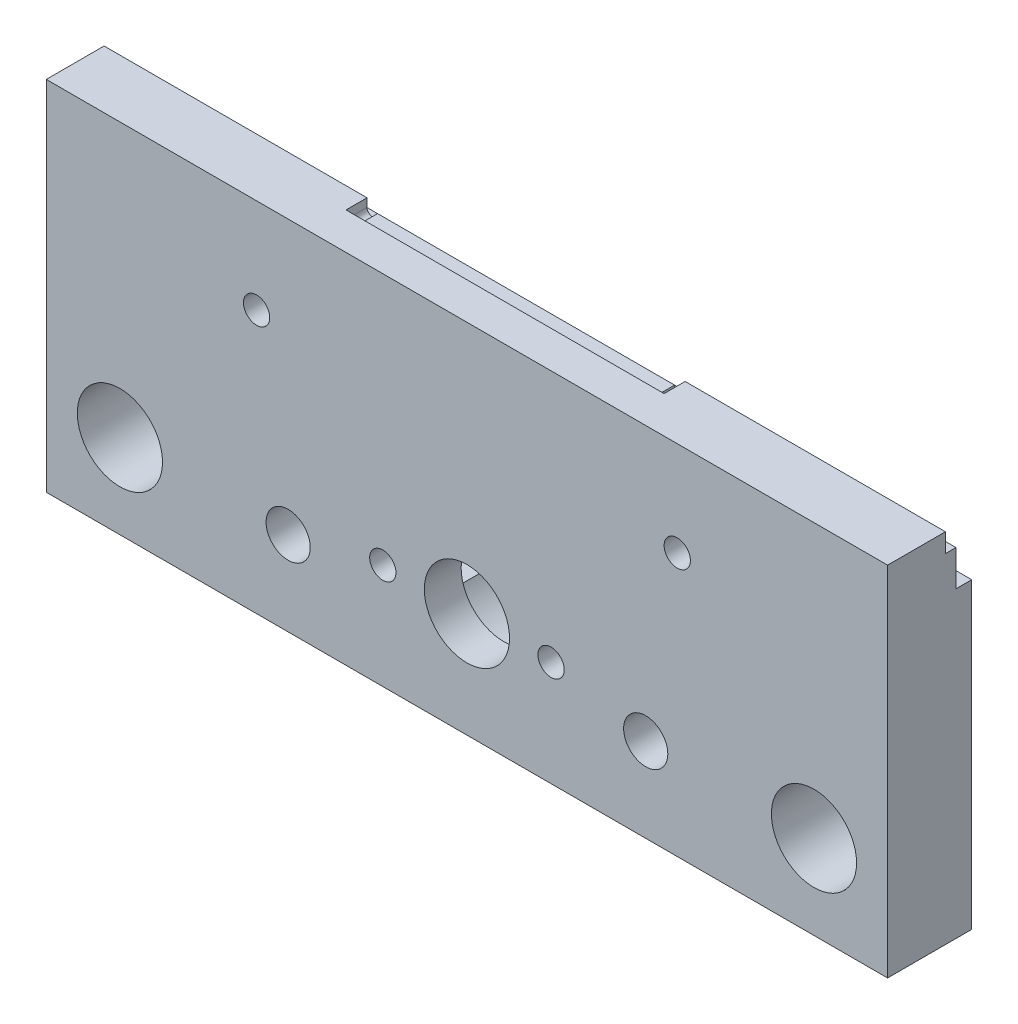
ISO-10303-21;
HEADER;
FILE_DESCRIPTION(('STEP AP214'),'2;1');
FILE_NAME('part.step','',(''),(''),'','','');
FILE_SCHEMA(('AUTOMOTIVE_DESIGN { 1 0 10303 214 1 1 1 1 }'));
ENDSEC;
DATA;
#1=APPLICATION_CONTEXT('core data for automotive mechanical design processes');
#2=APPLICATION_PROTOCOL_DEFINITION('international standard','automotive_design',2000,#1);
#3=PRODUCT_CONTEXT('',#1,'mechanical');
#4=PRODUCT('Part','Part','',(#3));
#5=PRODUCT_RELATED_PRODUCT_CATEGORY('part','',(#4));
#6=PRODUCT_DEFINITION_FORMATION('','',#4);
#7=PRODUCT_DEFINITION_CONTEXT('part definition',#1,'design');
#8=PRODUCT_DEFINITION('design','',#6,#7);
#9=PRODUCT_DEFINITION_SHAPE('','',#8);
#10=(LENGTH_UNIT() NAMED_UNIT(*) SI_UNIT(.MILLI.,.METRE.));
#11=(NAMED_UNIT(*) PLANE_ANGLE_UNIT() SI_UNIT($,.RADIAN.));
#12=(NAMED_UNIT(*) SI_UNIT($,.STERADIAN.) SOLID_ANGLE_UNIT());
#13=UNCERTAINTY_MEASURE_WITH_UNIT(LENGTH_MEASURE(1.E-05),#10,'distance_accuracy_value','');
#14=(GEOMETRIC_REPRESENTATION_CONTEXT(3) GLOBAL_UNCERTAINTY_ASSIGNED_CONTEXT((#13)) GLOBAL_UNIT_ASSIGNED_CONTEXT((#10,
#11,#12)) REPRESENTATION_CONTEXT('',''));
#15=CARTESIAN_POINT('',(0.,0.,0.));
#16=DIRECTION('',(0.,0.,1.));
#17=DIRECTION('',(1.,0.,0.));
#18=AXIS2_PLACEMENT_3D('',#15,#16,#17);
#19=CARTESIAN_POINT('',(40.,10.,8.));
#20=DIRECTION('',(0.,0.,-1.));
#21=DIRECTION('',(-1.,0.,0.));
#22=AXIS2_PLACEMENT_3D('',#19,#20,#21);
#23=CYLINDRICAL_SURFACE('',#22,4.05);
#24=CARTESIAN_POINT('',(40.,10.,8.));
#25=DIRECTION('',(0.,0.,1.));
#26=DIRECTION('',(1.,0.,0.));
#27=AXIS2_PLACEMENT_3D('',#24,#25,#26);
#28=CIRCLE('',#27,4.05);
#29=CARTESIAN_POINT('',(44.05,10.,8.));
#30=VERTEX_POINT('',#29);
#31=EDGE_CURVE('E333',#30,#30,#28,.T.);
#32=ORIENTED_EDGE('',*,*,#31,.T.);
#33=EDGE_LOOP('',(#32));
#34=FACE_BOUND('',#33,.T.);
#35=CARTESIAN_POINT('',(40.,10.,4.5));
#36=DIRECTION('',(0.,0.,-1.));
#37=DIRECTION('',(-1.,0.,0.));
#38=AXIS2_PLACEMENT_3D('',#35,#36,#37);
#39=CIRCLE('',#38,4.05);
#40=CARTESIAN_POINT('',(35.95,10.,4.5));
#41=VERTEX_POINT('',#40);
#42=EDGE_CURVE('E44',#41,#41,#39,.T.);
#43=ORIENTED_EDGE('',*,*,#42,.T.);
#44=EDGE_LOOP('',(#43));
#45=FACE_BOUND('',#44,.T.);
#46=ADVANCED_FACE('F35',(#34,#45),#23,.F.);
#47=CARTESIAN_POINT('',(0.,0.,8.));
#48=DIRECTION('',(0.,0.,1.));
#49=DIRECTION('',(1.,0.,0.));
#50=AXIS2_PLACEMENT_3D('',#47,#48,#49);
#51=PLANE('',#50);
#52=CARTESIAN_POINT('',(23.,8.,8.));
#53=DIRECTION('',(0.,0.,1.));
#54=DIRECTION('',(1.,0.,0.));
#55=AXIS2_PLACEMENT_3D('',#52,#53,#54);
#56=CIRCLE('',#55,2.1);
#57=CARTESIAN_POINT('',(25.1,8.,8.));
#58=VERTEX_POINT('',#57);
#59=EDGE_CURVE('E406',#58,#58,#56,.T.);
#60=ORIENTED_EDGE('',*,*,#59,.F.);
#61=EDGE_LOOP('',(#60));
#62=FACE_BOUND('',#61,.T.);
#63=CARTESIAN_POINT('',(57.,8.,8.));
#64=DIRECTION('',(0.,0.,1.));
#65=DIRECTION('',(1.,0.,0.));
#66=AXIS2_PLACEMENT_3D('',#63,#64,#65);
#67=CIRCLE('',#66,2.1);
#68=CARTESIAN_POINT('',(59.1,8.,8.));
#69=VERTEX_POINT('',#68);
#70=EDGE_CURVE('E400',#69,#69,#67,.T.);
#71=ORIENTED_EDGE('',*,*,#70,.F.);
#72=EDGE_LOOP('',(#71));
#73=FACE_BOUND('',#72,.T.);
#74=CARTESIAN_POINT('',(20.,25.,8.));
#75=DIRECTION('',(0.,0.,1.));
#76=DIRECTION('',(1.,0.,0.));
#77=AXIS2_PLACEMENT_3D('',#74,#75,#76);
#78=CIRCLE('',#77,1.24999999999999);
#79=CARTESIAN_POINT('',(21.25,25.,8.));
#80=VERTEX_POINT('',#79);
#81=EDGE_CURVE('E394',#80,#80,#78,.T.);
#82=ORIENTED_EDGE('',*,*,#81,.F.);
#83=EDGE_LOOP('',(#82));
#84=FACE_BOUND('',#83,.T.);
#85=CARTESIAN_POINT('',(60.,25.,8.));
#86=DIRECTION('',(0.,0.,1.));
#87=DIRECTION('',(1.,0.,0.));
#88=AXIS2_PLACEMENT_3D('',#85,#86,#87);
#89=CIRCLE('',#88,1.24999999999999);
#90=CARTESIAN_POINT('',(61.25,25.,8.));
#91=VERTEX_POINT('',#90);
#92=EDGE_CURVE('E388',#91,#91,#89,.T.);
#93=ORIENTED_EDGE('',*,*,#92,.F.);
#94=EDGE_LOOP('',(#93));
#95=FACE_BOUND('',#94,.T.);
#96=CARTESIAN_POINT('',(32.,10.,8.));
#97=DIRECTION('',(0.,0.,1.));
#98=DIRECTION('',(1.,0.,0.));
#99=AXIS2_PLACEMENT_3D('',#96,#97,#98);
#100=CIRCLE('',#99,1.24999999999999);
#101=CARTESIAN_POINT('',(33.25,10.,8.));
#102=VERTEX_POINT('',#101);
#103=EDGE_CURVE('E381',#102,#102,#100,.T.);
#104=ORIENTED_EDGE('',*,*,#103,.F.);
#105=EDGE_LOOP('',(#104));
#106=FACE_BOUND('',#105,.T.);
#107=CARTESIAN_POINT('',(48.,10.,8.));
#108=DIRECTION('',(0.,0.,1.));
#109=DIRECTION('',(1.,0.,0.));
#110=AXIS2_PLACEMENT_3D('',#107,#108,#109);
#111=CIRCLE('',#110,1.24999999999999);
#112=CARTESIAN_POINT('',(49.25,10.,8.));
#113=VERTEX_POINT('',#112);
#114=EDGE_CURVE('E374',#113,#113,#111,.T.);
#115=ORIENTED_EDGE('',*,*,#114,.F.);
#116=EDGE_LOOP('',(#115));
#117=FACE_BOUND('',#116,.T.);
#118=ORIENTED_EDGE('',*,*,#31,.F.);
#119=EDGE_LOOP('',(#118));
#120=FACE_BOUND('',#119,.T.);
#121=DIRECTION('',(0.,-1.,0.));
#122=VECTOR('',#121,1.);
#123=CARTESIAN_POINT('',(0.,34.,8.));
#124=LINE('',#123,#122);
#125=CARTESIAN_POINT('',(0.,34.,8.));
#126=VERTEX_POINT('',#125);
#127=CARTESIAN_POINT('',(0.,0.,8.));
#128=VERTEX_POINT('',#127);
#129=EDGE_CURVE('E345',#126,#128,#124,.T.);
#130=ORIENTED_EDGE('',*,*,#129,.T.);
#131=DIRECTION('',(1.,0.,0.));
#132=VECTOR('',#131,1.);
#133=CARTESIAN_POINT('',(0.,0.,8.));
#134=LINE('',#133,#132);
#135=CARTESIAN_POINT('',(80.,0.,8.));
#136=VERTEX_POINT('',#135);
#137=EDGE_CURVE('E348',#128,#136,#134,.T.);
#138=ORIENTED_EDGE('',*,*,#137,.T.);
#139=DIRECTION('',(0.,1.,0.));
#140=VECTOR('',#139,1.);
#141=CARTESIAN_POINT('',(80.,0.,8.));
#142=LINE('',#141,#140);
#143=CARTESIAN_POINT('',(80.,34.,8.));
#144=VERTEX_POINT('',#143);
#145=EDGE_CURVE('E351',#136,#144,#142,.T.);
#146=ORIENTED_EDGE('',*,*,#145,.T.);
#147=DIRECTION('',(-1.,0.,0.));
#148=VECTOR('',#147,1.);
#149=CARTESIAN_POINT('',(80.,34.,8.));
#150=LINE('',#149,#148);
#151=EDGE_CURVE('E353',#144,#126,#150,.T.);
#152=ORIENTED_EDGE('',*,*,#151,.T.);
#153=EDGE_LOOP('',(#130,#138,#146,#152));
#154=FACE_BOUND('',#153,.T.);
#155=CARTESIAN_POINT('',(7.,8.,8.));
#156=DIRECTION('',(0.,0.,1.));
#157=DIRECTION('',(1.,0.,0.));
#158=AXIS2_PLACEMENT_3D('',#155,#156,#157);
#159=CIRCLE('',#158,4.05);
#160=CARTESIAN_POINT('',(11.05,8.,8.));
#161=VERTEX_POINT('',#160);
#162=EDGE_CURVE('E339',#161,#161,#159,.T.);
#163=ORIENTED_EDGE('',*,*,#162,.F.);
#164=EDGE_LOOP('',(#163));
#165=FACE_BOUND('',#164,.T.);
#166=CARTESIAN_POINT('',(73.,8.,8.));
#167=DIRECTION('',(0.,0.,1.));
#168=DIRECTION('',(1.,0.,0.));
#169=AXIS2_PLACEMENT_3D('',#166,#167,#168);
#170=CIRCLE('',#169,4.05);
#171=CARTESIAN_POINT('',(77.05,8.,8.));
#172=VERTEX_POINT('',#171);
#173=EDGE_CURVE('E330',#172,#172,#170,.T.);
#174=ORIENTED_EDGE('',*,*,#173,.F.);
#175=EDGE_LOOP('',(#174));
#176=FACE_BOUND('',#175,.T.);
#177=ADVANCED_FACE('F412',(#62,#73,#84,#95,#106,#117,#120,#154,#165,#176),#51,.T.);
#178=CARTESIAN_POINT('',(0.,0.,0.));
#179=DIRECTION('',(0.,0.,1.));
#180=DIRECTION('',(1.,0.,0.));
#181=AXIS2_PLACEMENT_3D('',#178,#179,#180);
#182=PLANE('',#181);
#183=CARTESIAN_POINT('',(23.,8.,0.));
#184=DIRECTION('',(0.,0.,1.));
#185=DIRECTION('',(1.,0.,0.));
#186=AXIS2_PLACEMENT_3D('',#183,#184,#185);
#187=CIRCLE('',#186,2.1);
#188=CARTESIAN_POINT('',(25.1,8.,0.));
#189=VERTEX_POINT('',#188);
#190=EDGE_CURVE('E403',#189,#189,#187,.T.);
#191=ORIENTED_EDGE('',*,*,#190,.T.);
#192=EDGE_LOOP('',(#191));
#193=FACE_BOUND('',#192,.T.);
#194=CARTESIAN_POINT('',(57.,8.,0.));
#195=DIRECTION('',(0.,0.,1.));
#196=DIRECTION('',(1.,0.,0.));
#197=AXIS2_PLACEMENT_3D('',#194,#195,#196);
#198=CIRCLE('',#197,2.1);
#199=CARTESIAN_POINT('',(59.1,8.,0.));
#200=VERTEX_POINT('',#199);
#201=EDGE_CURVE('E397',#200,#200,#198,.T.);
#202=ORIENTED_EDGE('',*,*,#201,.T.);
#203=EDGE_LOOP('',(#202));
#204=FACE_BOUND('',#203,.T.);
#205=CARTESIAN_POINT('',(20.,25.,0.));
#206=DIRECTION('',(0.,0.,1.));
#207=DIRECTION('',(1.,0.,0.));
#208=AXIS2_PLACEMENT_3D('',#205,#206,#207);
#209=CIRCLE('',#208,1.25);
#210=CARTESIAN_POINT('',(21.25,25.,0.));
#211=VERTEX_POINT('',#210);
#212=EDGE_CURVE('E391',#211,#211,#209,.T.);
#213=ORIENTED_EDGE('',*,*,#212,.T.);
#214=EDGE_LOOP('',(#213));
#215=FACE_BOUND('',#214,.T.);
#216=CARTESIAN_POINT('',(60.,25.,0.));
#217=DIRECTION('',(0.,0.,1.));
#218=DIRECTION('',(1.,0.,0.));
#219=AXIS2_PLACEMENT_3D('',#216,#217,#218);
#220=CIRCLE('',#219,1.25);
#221=CARTESIAN_POINT('',(61.25,25.,0.));
#222=VERTEX_POINT('',#221);
#223=EDGE_CURVE('E385',#222,#222,#220,.T.);
#224=ORIENTED_EDGE('',*,*,#223,.T.);
#225=EDGE_LOOP('',(#224));
#226=FACE_BOUND('',#225,.T.);
#227=DIRECTION('',(0.,-1.,0.));
#228=VECTOR('',#227,1.);
#229=CARTESIAN_POINT('',(0.,34.,0.));
#230=LINE('',#229,#228);
#231=CARTESIAN_POINT('',(0.,28.7999999999897,0.));
#232=VERTEX_POINT('',#231);
#233=CARTESIAN_POINT('',(0.,0.,0.));
#234=VERTEX_POINT('',#233);
#235=EDGE_CURVE('E342',#232,#234,#230,.T.);
#236=ORIENTED_EDGE('',*,*,#235,.F.);
#237=DIRECTION('',(1.,0.,0.));
#238=VECTOR('',#237,1.);
#239=CARTESIAN_POINT('',(0.,28.7999999999897,0.));
#240=LINE('',#239,#238);
#241=CARTESIAN_POINT('',(80.,28.7999999999897,0.));
#242=VERTEX_POINT('',#241);
#243=EDGE_CURVE('E318',#232,#242,#240,.T.);
#244=ORIENTED_EDGE('',*,*,#243,.T.);
#245=DIRECTION('',(0.,1.,0.));
#246=VECTOR('',#245,1.);
#247=CARTESIAN_POINT('',(80.,0.,0.));
#248=LINE('',#247,#246);
#249=CARTESIAN_POINT('',(80.,0.,0.));
#250=VERTEX_POINT('',#249);
#251=EDGE_CURVE('E349',#250,#242,#248,.T.);
#252=ORIENTED_EDGE('',*,*,#251,.F.);
#253=DIRECTION('',(1.,0.,0.));
#254=VECTOR('',#253,1.);
#255=CARTESIAN_POINT('',(0.,0.,0.));
#256=LINE('',#255,#254);
#257=EDGE_CURVE('E357',#234,#250,#256,.T.);
#258=ORIENTED_EDGE('',*,*,#257,.F.);
#259=EDGE_LOOP('',(#236,#244,#252,#258));
#260=FACE_BOUND('',#259,.T.);
#261=CARTESIAN_POINT('',(7.,8.,0.));
#262=DIRECTION('',(0.,0.,1.));
#263=DIRECTION('',(1.,0.,0.));
#264=AXIS2_PLACEMENT_3D('',#261,#262,#263);
#265=CIRCLE('',#264,4.05);
#266=CARTESIAN_POINT('',(11.05,8.,0.));
#267=VERTEX_POINT('',#266);
#268=EDGE_CURVE('E338',#267,#267,#265,.T.);
#269=ORIENTED_EDGE('',*,*,#268,.T.);
#270=EDGE_LOOP('',(#269));
#271=FACE_BOUND('',#270,.T.);
#272=DIRECTION('',(1.,0.,0.));
#273=VECTOR('',#272,1.);
#274=CARTESIAN_POINT('',(30.5,12.85,0.));
#275=LINE('',#274,#273);
#276=CARTESIAN_POINT('',(45.5623735940693,12.85,0.));
#277=VERTEX_POINT('',#276);
#278=CARTESIAN_POINT('',(49.5,12.85,0.));
#279=VERTEX_POINT('',#278);
#280=EDGE_CURVE('E275',#277,#279,#275,.T.);
#281=ORIENTED_EDGE('',*,*,#280,.F.);
#282=CARTESIAN_POINT('',(40.,10.,0.));
#283=DIRECTION('',(0.,0.,-1.));
#284=DIRECTION('',(-1.,0.,0.));
#285=AXIS2_PLACEMENT_3D('',#282,#283,#284);
#286=CIRCLE('',#285,6.25);
#287=CARTESIAN_POINT('',(34.4376264059307,12.85,0.));
#288=VERTEX_POINT('',#287);
#289=EDGE_CURVE('E247',#288,#277,#286,.T.);
#290=ORIENTED_EDGE('',*,*,#289,.F.);
#291=CARTESIAN_POINT('',(30.5,12.85,0.));
#292=VERTEX_POINT('',#291);
#293=EDGE_CURVE('E276',#292,#288,#275,.T.);
#294=ORIENTED_EDGE('',*,*,#293,.F.);
#295=CARTESIAN_POINT('',(30.5,10.,0.));
#296=DIRECTION('',(0.,0.,-1.));
#297=DIRECTION('',(-1.,0.,0.));
#298=AXIS2_PLACEMENT_3D('',#295,#296,#297);
#299=CIRCLE('',#298,2.85);
#300=CARTESIAN_POINT('',(30.5,7.15,0.));
#301=VERTEX_POINT('',#300);
#302=EDGE_CURVE('E257',#301,#292,#299,.T.);
#303=ORIENTED_EDGE('',*,*,#302,.F.);
#304=DIRECTION('',(-1.,0.,0.));
#305=VECTOR('',#304,1.);
#306=CARTESIAN_POINT('',(49.5,7.15,0.));
#307=LINE('',#306,#305);
#308=CARTESIAN_POINT('',(34.4376264059307,7.15,0.));
#309=VERTEX_POINT('',#308);
#310=EDGE_CURVE('E282',#309,#301,#307,.T.);
#311=ORIENTED_EDGE('',*,*,#310,.F.);
#312=CARTESIAN_POINT('',(45.5623735940693,7.15,0.));
#313=VERTEX_POINT('',#312);
#314=EDGE_CURVE('E236',#313,#309,#286,.T.);
#315=ORIENTED_EDGE('',*,*,#314,.F.);
#316=CARTESIAN_POINT('',(49.5,7.15,0.));
#317=VERTEX_POINT('',#316);
#318=EDGE_CURVE('E262',#317,#313,#307,.T.);
#319=ORIENTED_EDGE('',*,*,#318,.F.);
#320=CARTESIAN_POINT('',(49.5,10.,0.));
#321=DIRECTION('',(0.,0.,-1.));
#322=DIRECTION('',(-1.,0.,0.));
#323=AXIS2_PLACEMENT_3D('',#320,#321,#322);
#324=CIRCLE('',#323,2.85);
#325=EDGE_CURVE('E279',#279,#317,#324,.T.);
#326=ORIENTED_EDGE('',*,*,#325,.F.);
#327=EDGE_LOOP('',(#281,#290,#294,#303,#311,#315,#319,#326));
#328=FACE_BOUND('',#327,.T.);
#329=CARTESIAN_POINT('',(73.,8.,0.));
#330=DIRECTION('',(0.,0.,1.));
#331=DIRECTION('',(1.,0.,0.));
#332=AXIS2_PLACEMENT_3D('',#329,#330,#331);
#333=CIRCLE('',#332,4.05);
#334=CARTESIAN_POINT('',(77.05,8.,0.));
#335=VERTEX_POINT('',#334);
#336=EDGE_CURVE('E321',#335,#335,#333,.T.);
#337=ORIENTED_EDGE('',*,*,#336,.T.);
#338=EDGE_LOOP('',(#337));
#339=FACE_BOUND('',#338,.T.);
#340=ADVANCED_FACE('F415',(#193,#204,#215,#226,#260,#271,#328,#339),#182,.F.);
#341=CARTESIAN_POINT('',(0.,34.,8.));
#342=DIRECTION('',(1.,0.,0.));
#343=DIRECTION('',(0.,0.,-1.));
#344=AXIS2_PLACEMENT_3D('',#341,#342,#343);
#345=PLANE('',#344);
#346=DIRECTION('',(0.,-1.,0.));
#347=VECTOR('',#346,1.);
#348=CARTESIAN_POINT('',(0.,32.2,1.5));
#349=LINE('',#348,#347);
#350=CARTESIAN_POINT('',(0.,32.2,1.5));
#351=VERTEX_POINT('',#350);
#352=CARTESIAN_POINT('',(0.,28.8,1.5));
#353=VERTEX_POINT('',#352);
#354=EDGE_CURVE('E302',#351,#353,#349,.T.);
#355=ORIENTED_EDGE('',*,*,#354,.T.);
#356=DIRECTION('',(0.,-6.85562717706034E-12,-1.));
#357=VECTOR('',#356,1.);
#358=CARTESIAN_POINT('',(0.,28.8,1.5));
#359=LINE('',#358,#357);
#360=EDGE_CURVE('E305',#353,#232,#359,.T.);
#361=ORIENTED_EDGE('',*,*,#360,.T.);
#362=ORIENTED_EDGE('',*,*,#235,.T.);
#363=DIRECTION('',(0.,0.,-1.));
#364=VECTOR('',#363,1.);
#365=CARTESIAN_POINT('',(0.,0.,8.));
#366=LINE('',#365,#364);
#367=EDGE_CURVE('E369',#128,#234,#366,.T.);
#368=ORIENTED_EDGE('',*,*,#367,.F.);
#369=ORIENTED_EDGE('',*,*,#129,.F.);
#370=DIRECTION('',(0.,0.,-1.));
#371=VECTOR('',#370,1.);
#372=CARTESIAN_POINT('',(0.,34.,8.));
#373=LINE('',#372,#371);
#374=CARTESIAN_POINT('',(0.,34.,2.5));
#375=VERTEX_POINT('',#374);
#376=EDGE_CURVE('E355',#126,#375,#373,.T.);
#377=ORIENTED_EDGE('',*,*,#376,.T.);
#378=DIRECTION('',(0.,-1.,0.));
#379=VECTOR('',#378,1.);
#380=CARTESIAN_POINT('',(0.,32.2,2.5));
#381=LINE('',#380,#379);
#382=CARTESIAN_POINT('',(0.,32.2,2.5));
#383=VERTEX_POINT('',#382);
#384=EDGE_CURVE('E295',#375,#383,#381,.T.);
#385=ORIENTED_EDGE('',*,*,#384,.T.);
#386=DIRECTION('',(0.,0.,-1.));
#387=VECTOR('',#386,1.);
#388=CARTESIAN_POINT('',(0.,32.2,1.5));
#389=LINE('',#388,#387);
#390=EDGE_CURVE('E298',#383,#351,#389,.T.);
#391=ORIENTED_EDGE('',*,*,#390,.T.);
#392=EDGE_LOOP('',(#355,#361,#362,#368,#369,#377,#385,#391));
#393=FACE_BOUND('',#392,.T.);
#394=ADVANCED_FACE('F37',(#393),#345,.F.);
#395=CARTESIAN_POINT('',(0.,0.,8.));
#396=DIRECTION('',(0.,1.,0.));
#397=DIRECTION('',(0.,0.,1.));
#398=AXIS2_PLACEMENT_3D('',#395,#396,#397);
#399=PLANE('',#398);
#400=ORIENTED_EDGE('',*,*,#257,.T.);
#401=DIRECTION('',(0.,0.,-1.));
#402=VECTOR('',#401,1.);
#403=CARTESIAN_POINT('',(80.,0.,8.));
#404=LINE('',#403,#402);
#405=EDGE_CURVE('E366',#136,#250,#404,.T.);
#406=ORIENTED_EDGE('',*,*,#405,.F.);
#407=ORIENTED_EDGE('',*,*,#137,.F.);
#408=ORIENTED_EDGE('',*,*,#367,.T.);
#409=EDGE_LOOP('',(#400,#406,#407,#408));
#410=FACE_BOUND('',#409,.T.);
#411=ADVANCED_FACE('F449',(#410),#399,.F.);
#412=CARTESIAN_POINT('',(80.,0.,8.));
#413=DIRECTION('',(-1.,0.,0.));
#414=DIRECTION('',(0.,0.,1.));
#415=AXIS2_PLACEMENT_3D('',#412,#413,#414);
#416=PLANE('',#415);
#417=ORIENTED_EDGE('',*,*,#251,.T.);
#418=DIRECTION('',(0.,-6.85562717706034E-12,-1.));
#419=VECTOR('',#418,1.);
#420=CARTESIAN_POINT('',(80.,28.8,1.5));
#421=LINE('',#420,#419);
#422=CARTESIAN_POINT('',(80.,28.8,1.5));
#423=VERTEX_POINT('',#422);
#424=EDGE_CURVE('E299',#423,#242,#421,.T.);
#425=ORIENTED_EDGE('',*,*,#424,.F.);
#426=DIRECTION('',(0.,-1.,0.));
#427=VECTOR('',#426,1.);
#428=CARTESIAN_POINT('',(80.,32.2,1.5));
#429=LINE('',#428,#427);
#430=CARTESIAN_POINT('',(80.,32.2,1.5));
#431=VERTEX_POINT('',#430);
#432=EDGE_CURVE('E314',#431,#423,#429,.T.);
#433=ORIENTED_EDGE('',*,*,#432,.F.);
#434=DIRECTION('',(0.,0.,-1.));
#435=VECTOR('',#434,1.);
#436=CARTESIAN_POINT('',(80.,32.2,1.5));
#437=LINE('',#436,#435);
#438=CARTESIAN_POINT('',(80.,32.2,2.5));
#439=VERTEX_POINT('',#438);
#440=EDGE_CURVE('E311',#439,#431,#437,.T.);
#441=ORIENTED_EDGE('',*,*,#440,.F.);
#442=DIRECTION('',(0.,-1.,0.));
#443=VECTOR('',#442,1.);
#444=CARTESIAN_POINT('',(80.,32.2,2.5));
#445=LINE('',#444,#443);
#446=CARTESIAN_POINT('',(80.,34.,2.5));
#447=VERTEX_POINT('',#446);
#448=EDGE_CURVE('E288',#447,#439,#445,.T.);
#449=ORIENTED_EDGE('',*,*,#448,.F.);
#450=DIRECTION('',(0.,0.,-1.));
#451=VECTOR('',#450,1.);
#452=CARTESIAN_POINT('',(80.,34.,8.));
#453=LINE('',#452,#451);
#454=EDGE_CURVE('E363',#144,#447,#453,.T.);
#455=ORIENTED_EDGE('',*,*,#454,.F.);
#456=ORIENTED_EDGE('',*,*,#145,.F.);
#457=ORIENTED_EDGE('',*,*,#405,.T.);
#458=EDGE_LOOP('',(#417,#425,#433,#441,#449,#455,#456,#457));
#459=FACE_BOUND('',#458,.T.);
#460=ADVANCED_FACE('F466',(#459),#416,.F.);
#461=CARTESIAN_POINT('',(80.,34.,8.));
#462=DIRECTION('',(0.,-1.,0.));
#463=DIRECTION('',(1.,0.,0.));
#464=AXIS2_PLACEMENT_3D('',#461,#462,#463);
#465=PLANE('',#464);
#466=DIRECTION('',(1.,0.,0.));
#467=VECTOR('',#466,1.);
#468=CARTESIAN_POINT('',(25.000000000049,34.,4.49999999999999));
#469=LINE('',#468,#467);
#470=CARTESIAN_POINT('',(25.000000000049,34.,4.49999999999999));
#471=VERTEX_POINT('',#470);
#472=CARTESIAN_POINT('',(55.247938177816,34.,4.49999999999999));
#473=VERTEX_POINT('',#472);
#474=EDGE_CURVE('E204',#471,#473,#469,.T.);
#475=ORIENTED_EDGE('',*,*,#474,.F.);
#476=DIRECTION('',(0.,0.,-1.));
#477=VECTOR('',#476,1.);
#478=CARTESIAN_POINT('',(25.000000000049,34.,4.49999999999999));
#479=LINE('',#478,#477);
#480=CARTESIAN_POINT('',(25.000000000049,34.,2.49999999999999));
#481=VERTEX_POINT('',#480);
#482=EDGE_CURVE('E187',#471,#481,#479,.T.);
#483=ORIENTED_EDGE('',*,*,#482,.T.);
#484=DIRECTION('',(1.,0.,0.));
#485=VECTOR('',#484,1.);
#486=CARTESIAN_POINT('',(0.,34.,2.5));
#487=LINE('',#486,#485);
#488=EDGE_CURVE('E328',#375,#481,#487,.T.);
#489=ORIENTED_EDGE('',*,*,#488,.F.);
#490=ORIENTED_EDGE('',*,*,#376,.F.);
#491=ORIENTED_EDGE('',*,*,#151,.F.);
#492=ORIENTED_EDGE('',*,*,#454,.T.);
#493=CARTESIAN_POINT('',(55.247938177816,34.,2.5));
#494=VERTEX_POINT('',#493);
#495=EDGE_CURVE('E308',#494,#447,#487,.T.);
#496=ORIENTED_EDGE('',*,*,#495,.F.);
#497=DIRECTION('',(0.,0.,-1.));
#498=VECTOR('',#497,1.);
#499=CARTESIAN_POINT('',(55.247938177816,34.,4.49999999999999));
#500=LINE('',#499,#498);
#501=EDGE_CURVE('E52',#473,#494,#500,.T.);
#502=ORIENTED_EDGE('',*,*,#501,.F.);
#503=EDGE_LOOP('',(#475,#483,#489,#490,#491,#492,#496,#502));
#504=FACE_BOUND('',#503,.T.);
#505=ADVANCED_FACE('F209',(#504),#465,.F.);
#506=CARTESIAN_POINT('',(7.,8.,8.));
#507=DIRECTION('',(0.,0.,-1.));
#508=DIRECTION('',(-1.,0.,0.));
#509=AXIS2_PLACEMENT_3D('',#506,#507,#508);
#510=CYLINDRICAL_SURFACE('',#509,4.05);
#511=ORIENTED_EDGE('',*,*,#162,.T.);
#512=EDGE_LOOP('',(#511));
#513=FACE_BOUND('',#512,.T.);
#514=ORIENTED_EDGE('',*,*,#268,.F.);
#515=EDGE_LOOP('',(#514));
#516=FACE_BOUND('',#515,.T.);
#517=ADVANCED_FACE('F439',(#513,#516),#510,.F.);
#518=CARTESIAN_POINT('',(73.,8.,8.));
#519=DIRECTION('',(0.,0.,-1.));
#520=DIRECTION('',(-1.,0.,0.));
#521=AXIS2_PLACEMENT_3D('',#518,#519,#520);
#522=CYLINDRICAL_SURFACE('',#521,4.05);
#523=ORIENTED_EDGE('',*,*,#173,.T.);
#524=EDGE_LOOP('',(#523));
#525=FACE_BOUND('',#524,.T.);
#526=ORIENTED_EDGE('',*,*,#336,.F.);
#527=EDGE_LOOP('',(#526));
#528=FACE_BOUND('',#527,.T.);
#529=ADVANCED_FACE('F435',(#525,#528),#522,.F.);
#530=CARTESIAN_POINT('',(0.,28.8,1.5));
#531=DIRECTION('',(0.,-1.,6.85562717706035E-12));
#532=DIRECTION('',(0.,-6.85562717706035E-12,-1.));
#533=AXIS2_PLACEMENT_3D('',#530,#531,#532);
#534=PLANE('',#533);
#535=ORIENTED_EDGE('',*,*,#424,.T.);
#536=ORIENTED_EDGE('',*,*,#243,.F.);
#537=ORIENTED_EDGE('',*,*,#360,.F.);
#538=DIRECTION('',(1.,0.,0.));
#539=VECTOR('',#538,1.);
#540=CARTESIAN_POINT('',(0.,28.8,1.5));
#541=LINE('',#540,#539);
#542=EDGE_CURVE('E322',#353,#423,#541,.T.);
#543=ORIENTED_EDGE('',*,*,#542,.T.);
#544=EDGE_LOOP('',(#535,#536,#537,#543));
#545=FACE_BOUND('',#544,.T.);
#546=ADVANCED_FACE('F438',(#545),#534,.F.);
#547=CARTESIAN_POINT('',(0.,32.2,1.5));
#548=DIRECTION('',(0.,0.,1.));
#549=DIRECTION('',(0.,-1.,0.));
#550=AXIS2_PLACEMENT_3D('',#547,#548,#549);
#551=PLANE('',#550);
#552=ORIENTED_EDGE('',*,*,#432,.T.);
#553=ORIENTED_EDGE('',*,*,#542,.F.);
#554=ORIENTED_EDGE('',*,*,#354,.F.);
#555=DIRECTION('',(1.,0.,0.));
#556=VECTOR('',#555,1.);
#557=CARTESIAN_POINT('',(0.,32.2,1.5));
#558=LINE('',#557,#556);
#559=EDGE_CURVE('E324',#351,#431,#558,.T.);
#560=ORIENTED_EDGE('',*,*,#559,.T.);
#561=EDGE_LOOP('',(#552,#553,#554,#560));
#562=FACE_BOUND('',#561,.T.);
#563=ADVANCED_FACE('F530',(#562),#551,.F.);
#564=CARTESIAN_POINT('',(0.,32.2,1.5));
#565=DIRECTION('',(0.,-1.,0.));
#566=DIRECTION('',(0.,0.,-1.));
#567=AXIS2_PLACEMENT_3D('',#564,#565,#566);
#568=PLANE('',#567);
#569=ORIENTED_EDGE('',*,*,#440,.T.);
#570=ORIENTED_EDGE('',*,*,#559,.F.);
#571=ORIENTED_EDGE('',*,*,#390,.F.);
#572=DIRECTION('',(1.,0.,0.));
#573=VECTOR('',#572,1.);
#574=CARTESIAN_POINT('',(0.,32.2,2.5));
#575=LINE('',#574,#573);
#576=EDGE_CURVE('E326',#383,#439,#575,.T.);
#577=ORIENTED_EDGE('',*,*,#576,.T.);
#578=EDGE_LOOP('',(#569,#570,#571,#577));
#579=FACE_BOUND('',#578,.T.);
#580=ADVANCED_FACE('F534',(#579),#568,.F.);
#581=CARTESIAN_POINT('',(0.,32.2,2.5));
#582=DIRECTION('',(0.,0.,1.));
#583=DIRECTION('',(0.,-1.,0.));
#584=AXIS2_PLACEMENT_3D('',#581,#582,#583);
#585=PLANE('',#584);
#586=ORIENTED_EDGE('',*,*,#488,.T.);
#587=DIRECTION('',(0.,1.,0.));
#588=VECTOR('',#587,1.);
#589=CARTESIAN_POINT('',(25.000000000049,34.,2.49999999999999));
#590=LINE('',#589,#588);
#591=CARTESIAN_POINT('',(25.000000000049,33.2,2.49999999999999));
#592=VERTEX_POINT('',#591);
#593=EDGE_CURVE('E193',#592,#481,#590,.T.);
#594=ORIENTED_EDGE('',*,*,#593,.F.);
#595=CARTESIAN_POINT('',(25.500000000049,33.2,2.49999999999999));
#596=DIRECTION('',(0.,0.,-1.));
#597=DIRECTION('',(-1.,0.,0.));
#598=AXIS2_PLACEMENT_3D('',#595,#596,#597);
#599=CIRCLE('',#598,0.500000000000002);
#600=CARTESIAN_POINT('',(26.000000000049,33.2,2.49999999999999));
#601=VERTEX_POINT('',#600);
#602=EDGE_CURVE('E207',#601,#592,#599,.T.);
#603=ORIENTED_EDGE('',*,*,#602,.F.);
#604=DIRECTION('',(-1.,0.,0.));
#605=VECTOR('',#604,1.);
#606=CARTESIAN_POINT('',(26.000000000049,33.2,2.49999999999999));
#607=LINE('',#606,#605);
#608=CARTESIAN_POINT('',(54.247938177816,33.2,2.49999999999999));
#609=VERTEX_POINT('',#608);
#610=EDGE_CURVE('E229',#609,#601,#607,.T.);
#611=ORIENTED_EDGE('',*,*,#610,.F.);
#612=CARTESIAN_POINT('',(54.747938177816,33.2,2.49999999999999));
#613=DIRECTION('',(0.,0.,-1.));
#614=DIRECTION('',(-1.,0.,0.));
#615=AXIS2_PLACEMENT_3D('',#612,#613,#614);
#616=CIRCLE('',#615,0.5);
#617=CARTESIAN_POINT('',(55.247938177816,33.2,2.49999999999999));
#618=VERTEX_POINT('',#617);
#619=EDGE_CURVE('E226',#618,#609,#616,.T.);
#620=ORIENTED_EDGE('',*,*,#619,.F.);
#621=DIRECTION('',(0.,-1.,0.));
#622=VECTOR('',#621,1.);
#623=CARTESIAN_POINT('',(55.247938177816,34.,2.49999999999999));
#624=LINE('',#623,#622);
#625=EDGE_CURVE('E223',#494,#618,#624,.T.);
#626=ORIENTED_EDGE('',*,*,#625,.F.);
#627=ORIENTED_EDGE('',*,*,#495,.T.);
#628=ORIENTED_EDGE('',*,*,#448,.T.);
#629=ORIENTED_EDGE('',*,*,#576,.F.);
#630=ORIENTED_EDGE('',*,*,#384,.F.);
#631=EDGE_LOOP('',(#586,#594,#603,#611,#620,#626,#627,#628,#629,#630));
#632=FACE_BOUND('',#631,.T.);
#633=ADVANCED_FACE('F525',(#632),#585,.F.);
#634=CARTESIAN_POINT('',(30.5,12.85,4.5));
#635=DIRECTION('',(0.,1.,0.));
#636=DIRECTION('',(0.,0.,1.));
#637=AXIS2_PLACEMENT_3D('',#634,#635,#636);
#638=PLANE('',#637);
#639=ORIENTED_EDGE('',*,*,#293,.T.);
#640=DIRECTION('',(0.,0.,-1.));
#641=VECTOR('',#640,1.);
#642=CARTESIAN_POINT('',(34.4376264059307,12.85,4.5));
#643=LINE('',#642,#641);
#644=CARTESIAN_POINT('',(34.4376264059307,12.85,4.5));
#645=VERTEX_POINT('',#644);
#646=EDGE_CURVE('E254',#288,#645,#643,.F.);
#647=ORIENTED_EDGE('',*,*,#646,.T.);
#648=DIRECTION('',(1.,0.,0.));
#649=VECTOR('',#648,1.);
#650=CARTESIAN_POINT('',(30.5,12.85,4.5));
#651=LINE('',#650,#649);
#652=CARTESIAN_POINT('',(30.5,12.85,4.5));
#653=VERTEX_POINT('',#652);
#654=EDGE_CURVE('E263',#653,#645,#651,.T.);
#655=ORIENTED_EDGE('',*,*,#654,.F.);
#656=DIRECTION('',(0.,0.,-1.));
#657=VECTOR('',#656,1.);
#658=CARTESIAN_POINT('',(30.5,12.85,4.5));
#659=LINE('',#658,#657);
#660=EDGE_CURVE('E272',#653,#292,#659,.T.);
#661=ORIENTED_EDGE('',*,*,#660,.T.);
#662=EDGE_LOOP('',(#639,#647,#655,#661));
#663=FACE_BOUND('',#662,.T.);
#664=ADVANCED_FACE('F503',(#663),#638,.F.);
#665=CARTESIAN_POINT('',(49.5,7.15,4.5));
#666=DIRECTION('',(0.,-1.,0.));
#667=DIRECTION('',(0.,0.,-1.));
#668=AXIS2_PLACEMENT_3D('',#665,#666,#667);
#669=PLANE('',#668);
#670=DIRECTION('',(-1.,0.,0.));
#671=VECTOR('',#670,1.);
#672=CARTESIAN_POINT('',(49.5,7.15,4.5));
#673=LINE('',#672,#671);
#674=CARTESIAN_POINT('',(34.4376264059307,7.15,4.5));
#675=VERTEX_POINT('',#674);
#676=CARTESIAN_POINT('',(30.5,7.15,4.5));
#677=VERTEX_POINT('',#676);
#678=EDGE_CURVE('E268',#675,#677,#673,.T.);
#679=ORIENTED_EDGE('',*,*,#678,.F.);
#680=DIRECTION('',(0.,0.,-1.));
#681=VECTOR('',#680,1.);
#682=CARTESIAN_POINT('',(34.4376264059307,7.15,4.5));
#683=LINE('',#682,#681);
#684=EDGE_CURVE('E251',#675,#309,#683,.T.);
#685=ORIENTED_EDGE('',*,*,#684,.T.);
#686=ORIENTED_EDGE('',*,*,#310,.T.);
#687=DIRECTION('',(0.,0.,-1.));
#688=VECTOR('',#687,1.);
#689=CARTESIAN_POINT('',(30.5,7.15,4.5));
#690=LINE('',#689,#688);
#691=EDGE_CURVE('E285',#677,#301,#690,.T.);
#692=ORIENTED_EDGE('',*,*,#691,.F.);
#693=EDGE_LOOP('',(#679,#685,#686,#692));
#694=FACE_BOUND('',#693,.T.);
#695=ADVANCED_FACE('F497',(#694),#669,.F.);
#696=CARTESIAN_POINT('',(30.5,10.,4.5));
#697=DIRECTION('',(0.,0.,-1.));
#698=DIRECTION('',(-1.,0.,0.));
#699=AXIS2_PLACEMENT_3D('',#696,#697,#698);
#700=CYLINDRICAL_SURFACE('',#699,2.85);
#701=ORIENTED_EDGE('',*,*,#302,.T.);
#702=ORIENTED_EDGE('',*,*,#660,.F.);
#703=CARTESIAN_POINT('',(30.5,10.,4.5));
#704=DIRECTION('',(0.,0.,-1.));
#705=DIRECTION('',(-1.,0.,0.));
#706=AXIS2_PLACEMENT_3D('',#703,#704,#705);
#707=CIRCLE('',#706,2.85);
#708=EDGE_CURVE('E258',#677,#653,#707,.T.);
#709=ORIENTED_EDGE('',*,*,#708,.F.);
#710=ORIENTED_EDGE('',*,*,#691,.T.);
#711=EDGE_LOOP('',(#701,#702,#709,#710));
#712=FACE_BOUND('',#711,.T.);
#713=ADVANCED_FACE('F500',(#712),#700,.F.);
#714=CARTESIAN_POINT('',(45.5623735940693,12.85,4.5));
#715=VERTEX_POINT('',#714);
#716=CARTESIAN_POINT('',(49.5,12.85,4.5));
#717=VERTEX_POINT('',#716);
#718=EDGE_CURVE('E261',#715,#717,#651,.T.);
#719=ORIENTED_EDGE('',*,*,#718,.F.);
#720=DIRECTION('',(0.,0.,-1.));
#721=VECTOR('',#720,1.);
#722=CARTESIAN_POINT('',(45.5623735940693,12.85,4.5));
#723=LINE('',#722,#721);
#724=EDGE_CURVE('E245',#715,#277,#723,.T.);
#725=ORIENTED_EDGE('',*,*,#724,.T.);
#726=ORIENTED_EDGE('',*,*,#280,.T.);
#727=DIRECTION('',(0.,0.,-1.));
#728=VECTOR('',#727,1.);
#729=CARTESIAN_POINT('',(49.5,12.85,4.5));
#730=LINE('',#729,#728);
#731=EDGE_CURVE('E291',#717,#279,#730,.T.);
#732=ORIENTED_EDGE('',*,*,#731,.F.);
#733=EDGE_LOOP('',(#719,#725,#726,#732));
#734=FACE_BOUND('',#733,.T.);
#735=ADVANCED_FACE('F479',(#734),#638,.F.);
#736=CARTESIAN_POINT('',(30.5,10.,4.5));
#737=DIRECTION('',(0.,0.,-1.));
#738=DIRECTION('',(-1.,0.,0.));
#739=AXIS2_PLACEMENT_3D('',#736,#737,#738);
#740=PLANE('',#739);
#741=CARTESIAN_POINT('',(32.,10.,4.5));
#742=DIRECTION('',(0.,0.,-1.));
#743=DIRECTION('',(-1.,0.,0.));
#744=AXIS2_PLACEMENT_3D('',#741,#742,#743);
#745=CIRCLE('',#744,1.24999999999999);
#746=CARTESIAN_POINT('',(30.75,10.,4.5));
#747=VERTEX_POINT('',#746);
#748=EDGE_CURVE('E39',#747,#747,#745,.T.);
#749=ORIENTED_EDGE('',*,*,#748,.F.);
#750=EDGE_LOOP('',(#749));
#751=FACE_BOUND('',#750,.T.);
#752=CARTESIAN_POINT('',(48.,10.,4.5));
#753=DIRECTION('',(0.,0.,-1.));
#754=DIRECTION('',(-1.,0.,0.));
#755=AXIS2_PLACEMENT_3D('',#752,#753,#754);
#756=CIRCLE('',#755,1.24999999999999);
#757=CARTESIAN_POINT('',(46.75,10.,4.5));
#758=VERTEX_POINT('',#757);
#759=EDGE_CURVE('E224',#758,#758,#756,.T.);
#760=ORIENTED_EDGE('',*,*,#759,.F.);
#761=EDGE_LOOP('',(#760));
#762=FACE_BOUND('',#761,.T.);
#763=CARTESIAN_POINT('',(40.,10.,4.5));
#764=DIRECTION('',(0.,0.,-1.));
#765=DIRECTION('',(-1.,0.,0.));
#766=AXIS2_PLACEMENT_3D('',#763,#764,#765);
#767=CIRCLE('',#766,6.25);
#768=CARTESIAN_POINT('',(45.5623735940693,7.15,4.5));
#769=VERTEX_POINT('',#768);
#770=EDGE_CURVE('E246',#769,#675,#767,.T.);
#771=ORIENTED_EDGE('',*,*,#770,.T.);
#772=ORIENTED_EDGE('',*,*,#678,.T.);
#773=ORIENTED_EDGE('',*,*,#708,.T.);
#774=ORIENTED_EDGE('',*,*,#654,.T.);
#775=EDGE_CURVE('E60',#645,#715,#767,.T.);
#776=ORIENTED_EDGE('',*,*,#775,.T.);
#777=ORIENTED_EDGE('',*,*,#718,.T.);
#778=CARTESIAN_POINT('',(49.5,10.,4.5));
#779=DIRECTION('',(0.,0.,-1.));
#780=DIRECTION('',(-1.,0.,0.));
#781=AXIS2_PLACEMENT_3D('',#778,#779,#780);
#782=CIRCLE('',#781,2.85);
#783=CARTESIAN_POINT('',(49.5,7.15,4.5));
#784=VERTEX_POINT('',#783);
#785=EDGE_CURVE('E265',#717,#784,#782,.T.);
#786=ORIENTED_EDGE('',*,*,#785,.T.);
#787=EDGE_CURVE('E269',#784,#769,#673,.T.);
#788=ORIENTED_EDGE('',*,*,#787,.T.);
#789=EDGE_LOOP('',(#771,#772,#773,#774,#776,#777,#786,#788));
#790=FACE_BOUND('',#789,.T.);
#791=ORIENTED_EDGE('',*,*,#42,.F.);
#792=EDGE_LOOP('',(#791));
#793=FACE_BOUND('',#792,.T.);
#794=ADVANCED_FACE('F485',(#751,#762,#790,#793),#740,.T.);
#795=ORIENTED_EDGE('',*,*,#318,.T.);
#796=DIRECTION('',(0.,0.,-1.));
#797=VECTOR('',#796,1.);
#798=CARTESIAN_POINT('',(45.5623735940693,7.15,4.5));
#799=LINE('',#798,#797);
#800=EDGE_CURVE('E11',#313,#769,#799,.F.);
#801=ORIENTED_EDGE('',*,*,#800,.T.);
#802=ORIENTED_EDGE('',*,*,#787,.F.);
#803=DIRECTION('',(0.,0.,-1.));
#804=VECTOR('',#803,1.);
#805=CARTESIAN_POINT('',(49.5,7.15,4.5));
#806=LINE('',#805,#804);
#807=EDGE_CURVE('E289',#784,#317,#806,.T.);
#808=ORIENTED_EDGE('',*,*,#807,.T.);
#809=EDGE_LOOP('',(#795,#801,#802,#808));
#810=FACE_BOUND('',#809,.T.);
#811=ADVANCED_FACE('F488',(#810),#669,.F.);
#812=CARTESIAN_POINT('',(49.5,10.,4.5));
#813=DIRECTION('',(0.,0.,-1.));
#814=DIRECTION('',(-1.,0.,0.));
#815=AXIS2_PLACEMENT_3D('',#812,#813,#814);
#816=CYLINDRICAL_SURFACE('',#815,2.85);
#817=ORIENTED_EDGE('',*,*,#325,.T.);
#818=ORIENTED_EDGE('',*,*,#807,.F.);
#819=ORIENTED_EDGE('',*,*,#785,.F.);
#820=ORIENTED_EDGE('',*,*,#731,.T.);
#821=EDGE_LOOP('',(#817,#818,#819,#820));
#822=FACE_BOUND('',#821,.T.);
#823=ADVANCED_FACE('F482',(#822),#816,.F.);
#824=CARTESIAN_POINT('',(40.,10.,4.5));
#825=DIRECTION('',(0.,0.,-1.));
#826=DIRECTION('',(-1.,0.,0.));
#827=AXIS2_PLACEMENT_3D('',#824,#825,#826);
#828=CYLINDRICAL_SURFACE('',#827,6.25);
#829=ORIENTED_EDGE('',*,*,#770,.F.);
#830=ORIENTED_EDGE('',*,*,#800,.F.);
#831=ORIENTED_EDGE('',*,*,#314,.T.);
#832=ORIENTED_EDGE('',*,*,#684,.F.);
#833=EDGE_LOOP('',(#829,#830,#831,#832));
#834=FACE_BOUND('',#833,.T.);
#835=ADVANCED_FACE('F491',(#834),#828,.F.);
#836=ORIENTED_EDGE('',*,*,#289,.T.);
#837=ORIENTED_EDGE('',*,*,#724,.F.);
#838=ORIENTED_EDGE('',*,*,#775,.F.);
#839=ORIENTED_EDGE('',*,*,#646,.F.);
#840=EDGE_LOOP('',(#836,#837,#838,#839));
#841=FACE_BOUND('',#840,.T.);
#842=ADVANCED_FACE('F505',(#841),#828,.F.);
#843=CARTESIAN_POINT('',(25.000000000049,34.,4.49999999999999));
#844=DIRECTION('',(-1.,0.,0.));
#845=DIRECTION('',(0.,-1.,0.));
#846=AXIS2_PLACEMENT_3D('',#843,#844,#845);
#847=PLANE('',#846);
#848=ORIENTED_EDGE('',*,*,#593,.T.);
#849=ORIENTED_EDGE('',*,*,#482,.F.);
#850=DIRECTION('',(0.,1.,0.));
#851=VECTOR('',#850,1.);
#852=CARTESIAN_POINT('',(25.000000000049,34.,4.49999999999999));
#853=LINE('',#852,#851);
#854=CARTESIAN_POINT('',(25.000000000049,33.2,4.49999999999999));
#855=VERTEX_POINT('',#854);
#856=EDGE_CURVE('E190',#855,#471,#853,.T.);
#857=ORIENTED_EDGE('',*,*,#856,.F.);
#858=DIRECTION('',(0.,0.,-1.));
#859=VECTOR('',#858,1.);
#860=CARTESIAN_POINT('',(25.000000000049,33.2,4.49999999999999));
#861=LINE('',#860,#859);
#862=EDGE_CURVE('E234',#855,#592,#861,.T.);
#863=ORIENTED_EDGE('',*,*,#862,.T.);
#864=EDGE_LOOP('',(#848,#849,#857,#863));
#865=FACE_BOUND('',#864,.T.);
#866=ADVANCED_FACE('F189',(#865),#847,.F.);
#867=CARTESIAN_POINT('',(25.500000000049,33.2,4.49999999999999));
#868=DIRECTION('',(0.,0.,-1.));
#869=DIRECTION('',(-1.,0.,0.));
#870=AXIS2_PLACEMENT_3D('',#867,#868,#869);
#871=CYLINDRICAL_SURFACE('',#870,0.500000000000002);
#872=ORIENTED_EDGE('',*,*,#602,.T.);
#873=ORIENTED_EDGE('',*,*,#862,.F.);
#874=CARTESIAN_POINT('',(25.500000000049,33.2,4.49999999999999));
#875=DIRECTION('',(0.,0.,-1.));
#876=DIRECTION('',(-1.,0.,0.));
#877=AXIS2_PLACEMENT_3D('',#874,#875,#876);
#878=CIRCLE('',#877,0.500000000000002);
#879=CARTESIAN_POINT('',(26.000000000049,33.2,4.49999999999999));
#880=VERTEX_POINT('',#879);
#881=EDGE_CURVE('E198',#880,#855,#878,.T.);
#882=ORIENTED_EDGE('',*,*,#881,.F.);
#883=DIRECTION('',(0.,0.,-1.));
#884=VECTOR('',#883,1.);
#885=CARTESIAN_POINT('',(26.000000000049,33.2,4.49999999999999));
#886=LINE('',#885,#884);
#887=EDGE_CURVE('E237',#880,#601,#886,.T.);
#888=ORIENTED_EDGE('',*,*,#887,.T.);
#889=EDGE_LOOP('',(#872,#873,#882,#888));
#890=FACE_BOUND('',#889,.T.);
#891=ADVANCED_FACE('F512',(#890),#871,.F.);
#892=CARTESIAN_POINT('',(26.000000000049,33.2,4.49999999999999));
#893=DIRECTION('',(0.,-1.,0.));
#894=DIRECTION('',(1.,0.,0.));
#895=AXIS2_PLACEMENT_3D('',#892,#893,#894);
#896=PLANE('',#895);
#897=ORIENTED_EDGE('',*,*,#610,.T.);
#898=ORIENTED_EDGE('',*,*,#887,.F.);
#899=DIRECTION('',(-1.,0.,0.));
#900=VECTOR('',#899,1.);
#901=CARTESIAN_POINT('',(26.000000000049,33.2,4.49999999999999));
#902=LINE('',#901,#900);
#903=CARTESIAN_POINT('',(54.247938177816,33.2,4.49999999999999));
#904=VERTEX_POINT('',#903);
#905=EDGE_CURVE('E219',#904,#880,#902,.T.);
#906=ORIENTED_EDGE('',*,*,#905,.F.);
#907=DIRECTION('',(0.,0.,-1.));
#908=VECTOR('',#907,1.);
#909=CARTESIAN_POINT('',(54.247938177816,33.2,4.49999999999999));
#910=LINE('',#909,#908);
#911=EDGE_CURVE('E239',#904,#609,#910,.T.);
#912=ORIENTED_EDGE('',*,*,#911,.T.);
#913=EDGE_LOOP('',(#897,#898,#906,#912));
#914=FACE_BOUND('',#913,.T.);
#915=ADVANCED_FACE('F563',(#914),#896,.F.);
#916=CARTESIAN_POINT('',(54.747938177816,33.2,4.49999999999999));
#917=DIRECTION('',(0.,0.,-1.));
#918=DIRECTION('',(-1.,0.,0.));
#919=AXIS2_PLACEMENT_3D('',#916,#917,#918);
#920=CYLINDRICAL_SURFACE('',#919,0.5);
#921=ORIENTED_EDGE('',*,*,#619,.T.);
#922=ORIENTED_EDGE('',*,*,#911,.F.);
#923=CARTESIAN_POINT('',(54.747938177816,33.2,4.49999999999999));
#924=DIRECTION('',(0.,0.,-1.));
#925=DIRECTION('',(-1.,0.,0.));
#926=AXIS2_PLACEMENT_3D('',#923,#924,#925);
#927=CIRCLE('',#926,0.5);
#928=CARTESIAN_POINT('',(55.247938177816,33.2,4.49999999999999));
#929=VERTEX_POINT('',#928);
#930=EDGE_CURVE('E213',#929,#904,#927,.T.);
#931=ORIENTED_EDGE('',*,*,#930,.F.);
#932=DIRECTION('',(0.,0.,-1.));
#933=VECTOR('',#932,1.);
#934=CARTESIAN_POINT('',(55.247938177816,33.2,4.49999999999999));
#935=LINE('',#934,#933);
#936=EDGE_CURVE('E241',#929,#618,#935,.T.);
#937=ORIENTED_EDGE('',*,*,#936,.T.);
#938=EDGE_LOOP('',(#921,#922,#931,#937));
#939=FACE_BOUND('',#938,.T.);
#940=ADVANCED_FACE('F559',(#939),#920,.F.);
#941=CARTESIAN_POINT('',(55.247938177816,34.,4.49999999999999));
#942=DIRECTION('',(1.,0.,0.));
#943=DIRECTION('',(0.,0.,-1.));
#944=AXIS2_PLACEMENT_3D('',#941,#942,#943);
#945=PLANE('',#944);
#946=ORIENTED_EDGE('',*,*,#625,.T.);
#947=ORIENTED_EDGE('',*,*,#936,.F.);
#948=DIRECTION('',(0.,-1.,0.));
#949=VECTOR('',#948,1.);
#950=CARTESIAN_POINT('',(55.247938177816,34.,4.49999999999999));
#951=LINE('',#950,#949);
#952=EDGE_CURVE('E211',#473,#929,#951,.T.);
#953=ORIENTED_EDGE('',*,*,#952,.F.);
#954=ORIENTED_EDGE('',*,*,#501,.T.);
#955=EDGE_LOOP('',(#946,#947,#953,#954));
#956=FACE_BOUND('',#955,.T.);
#957=ADVANCED_FACE('F556',(#956),#945,.F.);
#958=CARTESIAN_POINT('',(25.500000000049,33.2,4.49999999999999));
#959=DIRECTION('',(0.,0.,-1.));
#960=DIRECTION('',(-1.,0.,0.));
#961=AXIS2_PLACEMENT_3D('',#958,#959,#960);
#962=PLANE('',#961);
#963=ORIENTED_EDGE('',*,*,#856,.T.);
#964=ORIENTED_EDGE('',*,*,#474,.T.);
#965=ORIENTED_EDGE('',*,*,#952,.T.);
#966=ORIENTED_EDGE('',*,*,#930,.T.);
#967=ORIENTED_EDGE('',*,*,#905,.T.);
#968=ORIENTED_EDGE('',*,*,#881,.T.);
#969=EDGE_LOOP('',(#963,#964,#965,#966,#967,#968));
#970=FACE_BOUND('',#969,.T.);
#971=ADVANCED_FACE('F202',(#970),#962,.T.);
#972=CARTESIAN_POINT('',(48.,10.,8.));
#973=DIRECTION('',(0.,0.,1.));
#974=DIRECTION('',(1.,0.,0.));
#975=AXIS2_PLACEMENT_3D('',#972,#973,#974);
#976=CYLINDRICAL_SURFACE('',#975,1.24999999999999);
#977=ORIENTED_EDGE('',*,*,#759,.T.);
#978=EDGE_LOOP('',(#977));
#979=FACE_BOUND('',#978,.T.);
#980=ORIENTED_EDGE('',*,*,#114,.T.);
#981=EDGE_LOOP('',(#980));
#982=FACE_BOUND('',#981,.T.);
#983=ADVANCED_FACE('F577',(#979,#982),#976,.F.);
#984=CARTESIAN_POINT('',(32.,10.,8.));
#985=DIRECTION('',(0.,0.,1.));
#986=DIRECTION('',(1.,0.,0.));
#987=AXIS2_PLACEMENT_3D('',#984,#985,#986);
#988=CYLINDRICAL_SURFACE('',#987,1.24999999999999);
#989=ORIENTED_EDGE('',*,*,#748,.T.);
#990=EDGE_LOOP('',(#989));
#991=FACE_BOUND('',#990,.T.);
#992=ORIENTED_EDGE('',*,*,#103,.T.);
#993=EDGE_LOOP('',(#992));
#994=FACE_BOUND('',#993,.T.);
#995=ADVANCED_FACE('F581',(#991,#994),#988,.F.);
#996=CARTESIAN_POINT('',(60.,25.,8.));
#997=DIRECTION('',(0.,0.,1.));
#998=DIRECTION('',(1.,0.,0.));
#999=AXIS2_PLACEMENT_3D('',#996,#997,#998);
#1000=CYLINDRICAL_SURFACE('',#999,1.24999999999999);
#1001=ORIENTED_EDGE('',*,*,#223,.F.);
#1002=EDGE_LOOP('',(#1001));
#1003=FACE_BOUND('',#1002,.T.);
#1004=ORIENTED_EDGE('',*,*,#92,.T.);
#1005=EDGE_LOOP('',(#1004));
#1006=FACE_BOUND('',#1005,.T.);
#1007=ADVANCED_FACE('F586',(#1003,#1006),#1000,.F.);
#1008=CARTESIAN_POINT('',(20.,25.,8.));
#1009=DIRECTION('',(0.,0.,1.));
#1010=DIRECTION('',(1.,0.,0.));
#1011=AXIS2_PLACEMENT_3D('',#1008,#1009,#1010);
#1012=CYLINDRICAL_SURFACE('',#1011,1.24999999999999);
#1013=ORIENTED_EDGE('',*,*,#212,.F.);
#1014=EDGE_LOOP('',(#1013));
#1015=FACE_BOUND('',#1014,.T.);
#1016=ORIENTED_EDGE('',*,*,#81,.T.);
#1017=EDGE_LOOP('',(#1016));
#1018=FACE_BOUND('',#1017,.T.);
#1019=ADVANCED_FACE('F590',(#1015,#1018),#1012,.F.);
#1020=CARTESIAN_POINT('',(57.,8.,8.));
#1021=DIRECTION('',(0.,0.,1.));
#1022=DIRECTION('',(1.,0.,0.));
#1023=AXIS2_PLACEMENT_3D('',#1020,#1021,#1022);
#1024=CYLINDRICAL_SURFACE('',#1023,2.1);
#1025=ORIENTED_EDGE('',*,*,#201,.F.);
#1026=EDGE_LOOP('',(#1025));
#1027=FACE_BOUND('',#1026,.T.);
#1028=ORIENTED_EDGE('',*,*,#70,.T.);
#1029=EDGE_LOOP('',(#1028));
#1030=FACE_BOUND('',#1029,.T.);
#1031=ADVANCED_FACE('F594',(#1027,#1030),#1024,.F.);
#1032=CARTESIAN_POINT('',(23.,8.,8.));
#1033=DIRECTION('',(0.,0.,1.));
#1034=DIRECTION('',(1.,0.,0.));
#1035=AXIS2_PLACEMENT_3D('',#1032,#1033,#1034);
#1036=CYLINDRICAL_SURFACE('',#1035,2.1);
#1037=ORIENTED_EDGE('',*,*,#190,.F.);
#1038=EDGE_LOOP('',(#1037));
#1039=FACE_BOUND('',#1038,.T.);
#1040=ORIENTED_EDGE('',*,*,#59,.T.);
#1041=EDGE_LOOP('',(#1040));
#1042=FACE_BOUND('',#1041,.T.);
#1043=ADVANCED_FACE('F410',(#1039,#1042),#1036,.F.);
#1044=CLOSED_SHELL('',(#46,#177,#340,#394,#411,#460,#505,#517,#529,#546,#563,#580,#633,#664,
#695,#713,#735,#794,#811,#823,#835,#842,#866,#891,#915,#940,#957,#971,#983,#995,#1007,#1019,
#1031,#1043));
#1045=MANIFOLD_SOLID_BREP('B2',#1044);
#1046=ADVANCED_BREP_SHAPE_REPRESENTATION('',(#18,#1045),#14);
#1047=SHAPE_DEFINITION_REPRESENTATION(#9,#1046);
ENDSEC;
END-ISO-10303-21;
